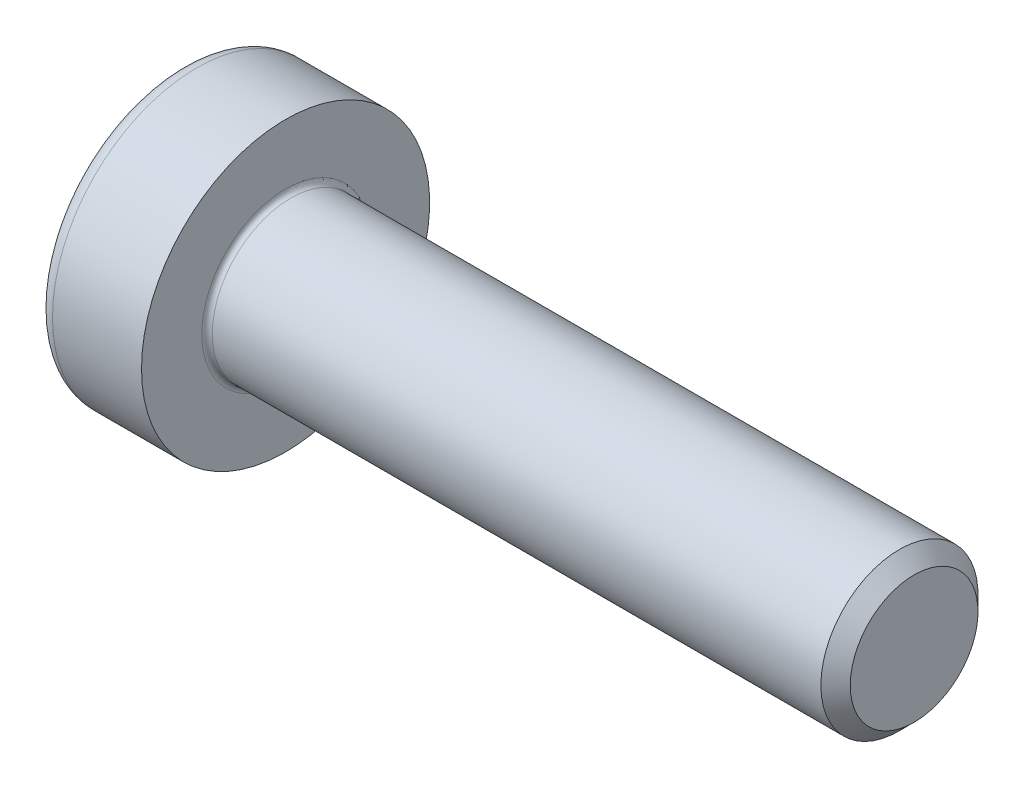
ISO-10303-21;
HEADER;
FILE_DESCRIPTION(('STEP AP214'),'2;1');
FILE_NAME('part.step','',(''),(''),'','','');
FILE_SCHEMA(('AUTOMOTIVE_DESIGN { 1 0 10303 214 1 1 1 1 }'));
ENDSEC;
DATA;
#1=APPLICATION_CONTEXT('core data for automotive mechanical design processes');
#2=APPLICATION_PROTOCOL_DEFINITION('international standard','automotive_design',2000,#1);
#3=PRODUCT_CONTEXT('',#1,'mechanical');
#4=PRODUCT('Part','Part','',(#3));
#5=PRODUCT_RELATED_PRODUCT_CATEGORY('part','',(#4));
#6=PRODUCT_DEFINITION_FORMATION('','',#4);
#7=PRODUCT_DEFINITION_CONTEXT('part definition',#1,'design');
#8=PRODUCT_DEFINITION('design','',#6,#7);
#9=PRODUCT_DEFINITION_SHAPE('','',#8);
#10=(LENGTH_UNIT() NAMED_UNIT(*) SI_UNIT(.MILLI.,.METRE.));
#11=(NAMED_UNIT(*) PLANE_ANGLE_UNIT() SI_UNIT($,.RADIAN.));
#12=(NAMED_UNIT(*) SI_UNIT($,.STERADIAN.) SOLID_ANGLE_UNIT());
#13=UNCERTAINTY_MEASURE_WITH_UNIT(LENGTH_MEASURE(1.E-05),#10,'distance_accuracy_value','');
#14=(GEOMETRIC_REPRESENTATION_CONTEXT(3) GLOBAL_UNCERTAINTY_ASSIGNED_CONTEXT((#13)) GLOBAL_UNIT_ASSIGNED_CONTEXT((#10,
#11,#12)) REPRESENTATION_CONTEXT('',''));
#15=CARTESIAN_POINT('',(0.,0.,0.));
#16=DIRECTION('',(0.,0.,1.));
#17=DIRECTION('',(1.,0.,0.));
#18=AXIS2_PLACEMENT_3D('',#15,#16,#17);
#19=CARTESIAN_POINT('',(0.,0.,0.));
#20=DIRECTION('',(-1.,0.,0.));
#21=DIRECTION('',(0.,0.,1.));
#22=AXIS2_PLACEMENT_3D('',#19,#20,#21);
#23=PLANE('',#22);
#24=DIRECTION('',(0.,-0.499999999999998,0.86602540378444));
#25=VECTOR('',#24,1.);
#26=CARTESIAN_POINT('',(0.,1.15470053837926,0.));
#27=LINE('',#26,#25);
#28=CARTESIAN_POINT('',(0.,1.15470053837926,0.));
#29=VERTEX_POINT('',#28);
#30=CARTESIAN_POINT('',(0.,0.577350269189634,0.999999999999994));
#31=VERTEX_POINT('',#30);
#32=EDGE_CURVE('E376',#29,#31,#27,.T.);
#33=ORIENTED_EDGE('',*,*,#32,.T.);
#34=DIRECTION('',(0.,1.,0.));
#35=VECTOR('',#34,1.);
#36=CARTESIAN_POINT('',(0.,-0.577350269189617,0.999999999999996));
#37=LINE('',#36,#35);
#38=CARTESIAN_POINT('',(0.,-0.577350269189617,0.999999999999996));
#39=VERTEX_POINT('',#38);
#40=EDGE_CURVE('E133',#39,#31,#37,.T.);
#41=ORIENTED_EDGE('',*,*,#40,.F.);
#42=DIRECTION('',(0.,-0.500000000000001,-0.866025403784438));
#43=VECTOR('',#42,1.);
#44=CARTESIAN_POINT('',(0.,-0.577350269189617,0.999999999999996));
#45=LINE('',#44,#43);
#46=CARTESIAN_POINT('',(0.,-1.15470053837924,0.));
#47=VERTEX_POINT('',#46);
#48=EDGE_CURVE('E379',#39,#47,#45,.T.);
#49=ORIENTED_EDGE('',*,*,#48,.T.);
#50=DIRECTION('',(0.,0.499999999999997,-0.86602540378444));
#51=VECTOR('',#50,1.);
#52=CARTESIAN_POINT('',(0.,-1.15470053837924,0.));
#53=LINE('',#52,#51);
#54=CARTESIAN_POINT('',(0.,-0.577350269189621,-1.));
#55=VERTEX_POINT('',#54);
#56=EDGE_CURVE('E382',#47,#55,#53,.T.);
#57=ORIENTED_EDGE('',*,*,#56,.T.);
#58=DIRECTION('',(0.,-1.,0.));
#59=VECTOR('',#58,1.);
#60=CARTESIAN_POINT('',(0.,0.57735026918963,-1.00000000000001));
#61=LINE('',#60,#59);
#62=CARTESIAN_POINT('',(0.,0.57735026918963,-1.00000000000001));
#63=VERTEX_POINT('',#62);
#64=EDGE_CURVE('E385',#63,#55,#61,.T.);
#65=ORIENTED_EDGE('',*,*,#64,.F.);
#66=DIRECTION('',(0.,-0.500000000000001,-0.866025403784438));
#67=VECTOR('',#66,1.);
#68=CARTESIAN_POINT('',(0.,1.15470053837926,0.));
#69=LINE('',#68,#67);
#70=EDGE_CURVE('E128',#29,#63,#69,.T.);
#71=ORIENTED_EDGE('',*,*,#70,.F.);
#72=EDGE_LOOP('',(#33,#41,#49,#57,#65,#71));
#73=FACE_BOUND('',#72,.T.);
#74=CARTESIAN_POINT('',(0.,0.,0.));
#75=DIRECTION('',(-1.,0.,0.));
#76=DIRECTION('',(0.,0.,1.));
#77=AXIS2_PLACEMENT_3D('',#74,#75,#76);
#78=CIRCLE('',#77,2.45);
#79=CARTESIAN_POINT('',(0.,0.,2.45));
#80=VERTEX_POINT('',#79);
#81=EDGE_CURVE('E45',#80,#80,#78,.T.);
#82=ORIENTED_EDGE('',*,*,#81,.T.);
#83=EDGE_LOOP('',(#82));
#84=FACE_BOUND('',#83,.T.);
#85=ADVANCED_FACE('F37',(#73,#84),#23,.T.);
#86=CARTESIAN_POINT('',(14.,1.2195,0.));
#87=DIRECTION('',(1.,0.,0.));
#88=DIRECTION('',(0.,0.,-1.));
#89=AXIS2_PLACEMENT_3D('',#86,#87,#88);
#90=PLANE('',#89);
#91=CARTESIAN_POINT('',(14.,0.,0.));
#92=DIRECTION('',(-1.,0.,0.));
#93=DIRECTION('',(0.,0.,1.));
#94=AXIS2_PLACEMENT_3D('',#91,#92,#93);
#95=CIRCLE('',#94,1.2195);
#96=CARTESIAN_POINT('',(14.,0.,1.2195));
#97=VERTEX_POINT('',#96);
#98=EDGE_CURVE('E151',#97,#97,#95,.T.);
#99=ORIENTED_EDGE('',*,*,#98,.F.);
#100=EDGE_LOOP('',(#99));
#101=FACE_BOUND('',#100,.T.);
#102=ADVANCED_FACE('F175',(#101),#90,.T.);
#103=CARTESIAN_POINT('',(14.,0.,0.));
#104=DIRECTION('',(-1.,0.,0.));
#105=DIRECTION('',(0.,0.,1.));
#106=AXIS2_PLACEMENT_3D('',#103,#104,#105);
#107=CONICAL_SURFACE('',#106,1.2195,0.785398163397433);
#108=CARTESIAN_POINT('',(13.7195,0.,0.));
#109=DIRECTION('',(-1.,0.,0.));
#110=DIRECTION('',(0.,0.,1.));
#111=AXIS2_PLACEMENT_3D('',#108,#109,#110);
#112=CIRCLE('',#111,1.49999999999999);
#113=CARTESIAN_POINT('',(13.7195,0.,1.49999999999999));
#114=VERTEX_POINT('',#113);
#115=EDGE_CURVE('E148',#114,#114,#112,.T.);
#116=ORIENTED_EDGE('',*,*,#115,.F.);
#117=EDGE_LOOP('',(#116));
#118=FACE_BOUND('',#117,.T.);
#119=ORIENTED_EDGE('',*,*,#98,.T.);
#120=EDGE_LOOP('',(#119));
#121=FACE_BOUND('',#120,.T.);
#122=ADVANCED_FACE('F181',(#118,#121),#107,.T.);
#123=CARTESIAN_POINT('',(-31.75,0.,0.));
#124=DIRECTION('',(-1.,0.,0.));
#125=DIRECTION('',(0.,0.,1.));
#126=AXIS2_PLACEMENT_3D('',#123,#124,#125);
#127=CYLINDRICAL_SURFACE('',#126,1.5);
#128=CARTESIAN_POINT('',(2.1,0.,0.));
#129=DIRECTION('',(1.,0.,0.));
#130=DIRECTION('',(0.,0.,-1.));
#131=AXIS2_PLACEMENT_3D('',#128,#129,#130);
#132=CIRCLE('',#131,1.5);
#133=CARTESIAN_POINT('',(2.1,0.,-1.5));
#134=VERTEX_POINT('',#133);
#135=EDGE_CURVE('E157',#134,#134,#132,.T.);
#136=ORIENTED_EDGE('',*,*,#135,.T.);
#137=EDGE_LOOP('',(#136));
#138=FACE_BOUND('',#137,.T.);
#139=ORIENTED_EDGE('',*,*,#115,.T.);
#140=EDGE_LOOP('',(#139));
#141=FACE_BOUND('',#140,.T.);
#142=ADVANCED_FACE('F193',(#138,#141),#127,.T.);
#143=CARTESIAN_POINT('',(2.,2.75,0.));
#144=DIRECTION('',(1.,0.,0.));
#145=DIRECTION('',(0.,0.,-1.));
#146=AXIS2_PLACEMENT_3D('',#143,#144,#145);
#147=PLANE('',#146);
#148=CARTESIAN_POINT('',(2.,0.,0.));
#149=DIRECTION('',(1.,0.,0.));
#150=DIRECTION('',(0.,0.,-1.));
#151=AXIS2_PLACEMENT_3D('',#148,#149,#150);
#152=CIRCLE('',#151,1.6);
#153=CARTESIAN_POINT('',(2.,0.,-1.6));
#154=VERTEX_POINT('',#153);
#155=EDGE_CURVE('E154',#154,#154,#152,.F.);
#156=ORIENTED_EDGE('',*,*,#155,.T.);
#157=EDGE_LOOP('',(#156));
#158=FACE_BOUND('',#157,.T.);
#159=CARTESIAN_POINT('',(2.,0.,0.));
#160=DIRECTION('',(-1.,0.,0.));
#161=DIRECTION('',(0.,0.,1.));
#162=AXIS2_PLACEMENT_3D('',#159,#160,#161);
#163=CIRCLE('',#162,2.75);
#164=CARTESIAN_POINT('',(2.,0.,2.75));
#165=VERTEX_POINT('',#164);
#166=EDGE_CURVE('E144',#165,#165,#163,.T.);
#167=ORIENTED_EDGE('',*,*,#166,.F.);
#168=EDGE_LOOP('',(#167));
#169=FACE_BOUND('',#168,.T.);
#170=ADVANCED_FACE('F189',(#158,#169),#147,.T.);
#171=CARTESIAN_POINT('',(-31.75,0.,0.));
#172=DIRECTION('',(-1.,0.,0.));
#173=DIRECTION('',(0.,0.,1.));
#174=AXIS2_PLACEMENT_3D('',#171,#172,#173);
#175=CYLINDRICAL_SURFACE('',#174,2.75);
#176=CARTESIAN_POINT('',(0.300000000000002,0.,0.));
#177=DIRECTION('',(-1.,0.,0.));
#178=DIRECTION('',(0.,0.,1.));
#179=AXIS2_PLACEMENT_3D('',#176,#177,#178);
#180=CIRCLE('',#179,2.75);
#181=CARTESIAN_POINT('',(0.300000000000002,0.,2.75));
#182=VERTEX_POINT('',#181);
#183=EDGE_CURVE('E11',#182,#182,#180,.F.);
#184=ORIENTED_EDGE('',*,*,#183,.T.);
#185=EDGE_LOOP('',(#184));
#186=FACE_BOUND('',#185,.T.);
#187=ORIENTED_EDGE('',*,*,#166,.T.);
#188=EDGE_LOOP('',(#187));
#189=FACE_BOUND('',#188,.T.);
#190=ADVANCED_FACE('F171',(#186,#189),#175,.T.);
#191=CARTESIAN_POINT('',(2.1,0.,0.));
#192=DIRECTION('',(1.,0.,0.));
#193=DIRECTION('',(0.,0.,-1.));
#194=AXIS2_PLACEMENT_3D('',#191,#192,#193);
#195=TOROIDAL_SURFACE('',#194,1.6,0.1);
#196=ORIENTED_EDGE('',*,*,#135,.F.);
#197=EDGE_LOOP('',(#196));
#198=FACE_BOUND('',#197,.T.);
#199=ORIENTED_EDGE('',*,*,#155,.F.);
#200=EDGE_LOOP('',(#199));
#201=FACE_BOUND('',#200,.T.);
#202=ADVANCED_FACE('F164',(#198,#201),#195,.F.);
#203=CARTESIAN_POINT('',(0.300000000000002,0.,0.));
#204=DIRECTION('',(-1.,0.,0.));
#205=DIRECTION('',(0.,0.,1.));
#206=AXIS2_PLACEMENT_3D('',#203,#204,#205);
#207=TOROIDAL_SURFACE('',#206,2.45,0.3);
#208=ORIENTED_EDGE('',*,*,#183,.F.);
#209=EDGE_LOOP('',(#208));
#210=FACE_BOUND('',#209,.T.);
#211=ORIENTED_EDGE('',*,*,#81,.F.);
#212=EDGE_LOOP('',(#211));
#213=FACE_BOUND('',#212,.T.);
#214=ADVANCED_FACE('F39',(#210,#213),#207,.T.);
#215=CARTESIAN_POINT('',(1.5,1.15470053837926,0.));
#216=DIRECTION('',(0.,-0.86602540378444,-0.499999999999998));
#217=DIRECTION('',(0.,0.499999999999998,-0.86602540378444));
#218=AXIS2_PLACEMENT_3D('',#215,#216,#217);
#219=PLANE('',#218);
#220=ORIENTED_EDGE('',*,*,#32,.F.);
#221=DIRECTION('',(-1.,0.,0.));
#222=VECTOR('',#221,1.);
#223=CARTESIAN_POINT('',(1.5,1.15470053837926,0.));
#224=LINE('',#223,#222);
#225=CARTESIAN_POINT('',(1.5,1.15470053837926,0.));
#226=VERTEX_POINT('',#225);
#227=EDGE_CURVE('E366',#226,#29,#224,.T.);
#228=ORIENTED_EDGE('',*,*,#227,.F.);
#229=DIRECTION('',(0.,-0.499999999999998,0.86602540378444));
#230=VECTOR('',#229,1.);
#231=CARTESIAN_POINT('',(1.5,1.15470053837926,0.));
#232=LINE('',#231,#230);
#233=CARTESIAN_POINT('',(1.5,0.866025403784442,0.499999999999999));
#234=VERTEX_POINT('',#233);
#235=EDGE_CURVE('E120',#226,#234,#232,.T.);
#236=ORIENTED_EDGE('',*,*,#235,.T.);
#237=CARTESIAN_POINT('',(1.5,0.577350269189634,0.999999999999994));
#238=VERTEX_POINT('',#237);
#239=EDGE_CURVE('E111',#234,#238,#232,.T.);
#240=ORIENTED_EDGE('',*,*,#239,.T.);
#241=DIRECTION('',(-1.,0.,0.));
#242=VECTOR('',#241,1.);
#243=CARTESIAN_POINT('',(1.5,0.577350269189634,0.999999999999994));
#244=LINE('',#243,#242);
#245=EDGE_CURVE('E125',#238,#31,#244,.T.);
#246=ORIENTED_EDGE('',*,*,#245,.T.);
#247=EDGE_LOOP('',(#220,#228,#236,#240,#246));
#248=FACE_BOUND('',#247,.T.);
#249=ADVANCED_FACE('F124',(#248),#219,.T.);
#250=CARTESIAN_POINT('',(1.5,-0.577350269189617,0.999999999999996));
#251=DIRECTION('',(0.,0.,1.));
#252=DIRECTION('',(0.,-1.,0.));
#253=AXIS2_PLACEMENT_3D('',#250,#251,#252);
#254=PLANE('',#253);
#255=ORIENTED_EDGE('',*,*,#40,.T.);
#256=ORIENTED_EDGE('',*,*,#245,.F.);
#257=DIRECTION('',(0.,1.,0.));
#258=VECTOR('',#257,1.);
#259=CARTESIAN_POINT('',(1.5,-0.577350269189617,0.999999999999996));
#260=LINE('',#259,#258);
#261=CARTESIAN_POINT('',(1.5,0.,0.999999999999995));
#262=VERTEX_POINT('',#261);
#263=EDGE_CURVE('E108',#262,#238,#260,.T.);
#264=ORIENTED_EDGE('',*,*,#263,.F.);
#265=CARTESIAN_POINT('',(1.5,-0.577350269189617,0.999999999999996));
#266=VERTEX_POINT('',#265);
#267=EDGE_CURVE('E119',#266,#262,#260,.T.);
#268=ORIENTED_EDGE('',*,*,#267,.F.);
#269=DIRECTION('',(-1.,0.,0.));
#270=VECTOR('',#269,1.);
#271=CARTESIAN_POINT('',(1.5,-0.577350269189617,0.999999999999996));
#272=LINE('',#271,#270);
#273=EDGE_CURVE('E135',#266,#39,#272,.T.);
#274=ORIENTED_EDGE('',*,*,#273,.T.);
#275=EDGE_LOOP('',(#255,#256,#264,#268,#274));
#276=FACE_BOUND('',#275,.T.);
#277=ADVANCED_FACE('F130',(#276),#254,.F.);
#278=CARTESIAN_POINT('',(1.5,-0.577350269189617,0.999999999999996));
#279=DIRECTION('',(0.,0.866025403784438,-0.500000000000001));
#280=DIRECTION('',(0.,0.500000000000001,0.866025403784438));
#281=AXIS2_PLACEMENT_3D('',#278,#279,#280);
#282=PLANE('',#281);
#283=ORIENTED_EDGE('',*,*,#48,.F.);
#284=ORIENTED_EDGE('',*,*,#273,.F.);
#285=DIRECTION('',(0.,-0.500000000000001,-0.866025403784438));
#286=VECTOR('',#285,1.);
#287=CARTESIAN_POINT('',(1.5,-0.577350269189617,0.999999999999996));
#288=LINE('',#287,#286);
#289=CARTESIAN_POINT('',(1.5,-0.86602540378443,0.499999999999997));
#290=VERTEX_POINT('',#289);
#291=EDGE_CURVE('E405',#266,#290,#288,.T.);
#292=ORIENTED_EDGE('',*,*,#291,.T.);
#293=CARTESIAN_POINT('',(1.5,-1.15470053837924,0.));
#294=VERTEX_POINT('',#293);
#295=EDGE_CURVE('E394',#290,#294,#288,.T.);
#296=ORIENTED_EDGE('',*,*,#295,.T.);
#297=DIRECTION('',(-1.,0.,0.));
#298=VECTOR('',#297,1.);
#299=CARTESIAN_POINT('',(1.5,-1.15470053837924,0.));
#300=LINE('',#299,#298);
#301=EDGE_CURVE('E140',#294,#47,#300,.T.);
#302=ORIENTED_EDGE('',*,*,#301,.T.);
#303=EDGE_LOOP('',(#283,#284,#292,#296,#302));
#304=FACE_BOUND('',#303,.T.);
#305=ADVANCED_FACE('F257',(#304),#282,.T.);
#306=CARTESIAN_POINT('',(1.5,-1.15470053837924,0.));
#307=DIRECTION('',(0.,0.86602540378444,0.499999999999998));
#308=DIRECTION('',(0.,-0.499999999999998,0.86602540378444));
#309=AXIS2_PLACEMENT_3D('',#306,#307,#308);
#310=PLANE('',#309);
#311=ORIENTED_EDGE('',*,*,#56,.F.);
#312=ORIENTED_EDGE('',*,*,#301,.F.);
#313=DIRECTION('',(0.,0.499999999999997,-0.86602540378444));
#314=VECTOR('',#313,1.);
#315=CARTESIAN_POINT('',(1.5,-1.15470053837924,0.));
#316=LINE('',#315,#314);
#317=CARTESIAN_POINT('',(1.5,-0.866025403784436,-0.499999999999995));
#318=VERTEX_POINT('',#317);
#319=EDGE_CURVE('E372',#294,#318,#316,.T.);
#320=ORIENTED_EDGE('',*,*,#319,.T.);
#321=CARTESIAN_POINT('',(1.5,-0.577350269189621,-1.));
#322=VERTEX_POINT('',#321);
#323=EDGE_CURVE('E404',#318,#322,#316,.T.);
#324=ORIENTED_EDGE('',*,*,#323,.T.);
#325=DIRECTION('',(-1.,0.,0.));
#326=VECTOR('',#325,1.);
#327=CARTESIAN_POINT('',(1.5,-0.577350269189621,-1.));
#328=LINE('',#327,#326);
#329=EDGE_CURVE('E365',#322,#55,#328,.T.);
#330=ORIENTED_EDGE('',*,*,#329,.T.);
#331=EDGE_LOOP('',(#311,#312,#320,#324,#330));
#332=FACE_BOUND('',#331,.T.);
#333=ADVANCED_FACE('F265',(#332),#310,.T.);
#334=CARTESIAN_POINT('',(1.5,0.57735026918963,-1.00000000000001));
#335=DIRECTION('',(0.,0.,-1.));
#336=DIRECTION('',(0.,1.,0.));
#337=AXIS2_PLACEMENT_3D('',#334,#335,#336);
#338=PLANE('',#337);
#339=ORIENTED_EDGE('',*,*,#64,.T.);
#340=ORIENTED_EDGE('',*,*,#329,.F.);
#341=DIRECTION('',(0.,-1.,0.));
#342=VECTOR('',#341,1.);
#343=CARTESIAN_POINT('',(1.5,0.57735026918963,-1.00000000000001));
#344=LINE('',#343,#342);
#345=CARTESIAN_POINT('',(1.5,0.,-1.));
#346=VERTEX_POINT('',#345);
#347=EDGE_CURVE('E369',#346,#322,#344,.T.);
#348=ORIENTED_EDGE('',*,*,#347,.F.);
#349=CARTESIAN_POINT('',(1.5,0.57735026918963,-1.00000000000001));
#350=VERTEX_POINT('',#349);
#351=EDGE_CURVE('E52',#350,#346,#344,.T.);
#352=ORIENTED_EDGE('',*,*,#351,.F.);
#353=DIRECTION('',(-1.,0.,0.));
#354=VECTOR('',#353,1.);
#355=CARTESIAN_POINT('',(1.5,0.57735026918963,-1.00000000000001));
#356=LINE('',#355,#354);
#357=EDGE_CURVE('E362',#350,#63,#356,.T.);
#358=ORIENTED_EDGE('',*,*,#357,.T.);
#359=EDGE_LOOP('',(#339,#340,#348,#352,#358));
#360=FACE_BOUND('',#359,.T.);
#361=ADVANCED_FACE('F274',(#360),#338,.F.);
#362=CARTESIAN_POINT('',(1.5,1.15470053837926,0.));
#363=DIRECTION('',(0.,0.866025403784438,-0.500000000000001));
#364=DIRECTION('',(0.,0.500000000000001,0.866025403784438));
#365=AXIS2_PLACEMENT_3D('',#362,#363,#364);
#366=PLANE('',#365);
#367=ORIENTED_EDGE('',*,*,#70,.T.);
#368=ORIENTED_EDGE('',*,*,#357,.F.);
#369=DIRECTION('',(0.,-0.500000000000001,-0.866025403784438));
#370=VECTOR('',#369,1.);
#371=CARTESIAN_POINT('',(1.5,1.15470053837926,0.));
#372=LINE('',#371,#370);
#373=CARTESIAN_POINT('',(1.5,0.866025403784445,-0.500000000000005));
#374=VERTEX_POINT('',#373);
#375=EDGE_CURVE('E352',#374,#350,#372,.T.);
#376=ORIENTED_EDGE('',*,*,#375,.F.);
#377=EDGE_CURVE('E358',#226,#374,#372,.T.);
#378=ORIENTED_EDGE('',*,*,#377,.F.);
#379=ORIENTED_EDGE('',*,*,#227,.T.);
#380=EDGE_LOOP('',(#367,#368,#376,#378,#379));
#381=FACE_BOUND('',#380,.T.);
#382=ADVANCED_FACE('F283',(#381),#366,.F.);
#383=CARTESIAN_POINT('',(1.5,1.73205080756888,-1.00000000000001));
#384=DIRECTION('',(1.,0.,0.));
#385=DIRECTION('',(0.,0.,-1.));
#386=AXIS2_PLACEMENT_3D('',#383,#384,#385);
#387=PLANE('',#386);
#388=ORIENTED_EDGE('',*,*,#347,.T.);
#389=ORIENTED_EDGE('',*,*,#323,.F.);
#390=CARTESIAN_POINT('',(1.5,0.,0.));
#391=DIRECTION('',(-1.,0.,0.));
#392=DIRECTION('',(0.,0.,1.));
#393=AXIS2_PLACEMENT_3D('',#390,#391,#392);
#394=CIRCLE('',#393,1.);
#395=EDGE_CURVE('E400',#346,#318,#394,.T.);
#396=ORIENTED_EDGE('',*,*,#395,.F.);
#397=EDGE_LOOP('',(#388,#389,#396));
#398=FACE_BOUND('',#397,.T.);
#399=ADVANCED_FACE('F292',(#398),#387,.F.);
#400=ORIENTED_EDGE('',*,*,#319,.F.);
#401=ORIENTED_EDGE('',*,*,#295,.F.);
#402=EDGE_CURVE('E138',#318,#290,#394,.T.);
#403=ORIENTED_EDGE('',*,*,#402,.F.);
#404=EDGE_LOOP('',(#400,#401,#403));
#405=FACE_BOUND('',#404,.T.);
#406=ADVANCED_FACE('F301',(#405),#387,.F.);
#407=ORIENTED_EDGE('',*,*,#291,.F.);
#408=ORIENTED_EDGE('',*,*,#267,.T.);
#409=EDGE_CURVE('E134',#290,#262,#394,.T.);
#410=ORIENTED_EDGE('',*,*,#409,.F.);
#411=EDGE_LOOP('',(#407,#408,#410));
#412=FACE_BOUND('',#411,.T.);
#413=ADVANCED_FACE('F310',(#412),#387,.F.);
#414=ORIENTED_EDGE('',*,*,#263,.T.);
#415=ORIENTED_EDGE('',*,*,#239,.F.);
#416=EDGE_CURVE('E114',#262,#234,#394,.T.);
#417=ORIENTED_EDGE('',*,*,#416,.F.);
#418=EDGE_LOOP('',(#414,#415,#417));
#419=FACE_BOUND('',#418,.T.);
#420=ADVANCED_FACE('F110',(#419),#387,.F.);
#421=ORIENTED_EDGE('',*,*,#235,.F.);
#422=ORIENTED_EDGE('',*,*,#377,.T.);
#423=EDGE_CURVE('E145',#234,#374,#394,.T.);
#424=ORIENTED_EDGE('',*,*,#423,.F.);
#425=EDGE_LOOP('',(#421,#422,#424));
#426=FACE_BOUND('',#425,.T.);
#427=ADVANCED_FACE('F325',(#426),#387,.F.);
#428=ORIENTED_EDGE('',*,*,#375,.T.);
#429=ORIENTED_EDGE('',*,*,#351,.T.);
#430=EDGE_CURVE('E355',#374,#346,#394,.T.);
#431=ORIENTED_EDGE('',*,*,#430,.F.);
#432=EDGE_LOOP('',(#428,#429,#431));
#433=FACE_BOUND('',#432,.T.);
#434=ADVANCED_FACE('F240',(#433),#387,.F.);
#435=CARTESIAN_POINT('',(1.5,0.,0.));
#436=DIRECTION('',(-1.,0.,0.));
#437=DIRECTION('',(0.,0.,1.));
#438=AXIS2_PLACEMENT_3D('',#435,#436,#437);
#439=CONICAL_SURFACE('',#438,1.,1.04719755119659);
#440=CARTESIAN_POINT('',(2.07735026918963,0.,0.));
#441=VERTEX_POINT('',#440);
#442=VERTEX_LOOP('',#441);
#443=FACE_BOUND('',#442,.T.);
#444=ORIENTED_EDGE('',*,*,#416,.T.);
#445=ORIENTED_EDGE('',*,*,#423,.T.);
#446=ORIENTED_EDGE('',*,*,#430,.T.);
#447=ORIENTED_EDGE('',*,*,#395,.T.);
#448=ORIENTED_EDGE('',*,*,#402,.T.);
#449=ORIENTED_EDGE('',*,*,#409,.T.);
#450=EDGE_LOOP('',(#444,#445,#446,#447,#448,#449));
#451=FACE_BOUND('',#450,.T.);
#452=ADVANCED_FACE('F186',(#443,#451),#439,.F.);
#453=CLOSED_SHELL('',(#85,#102,#122,#142,#170,#190,#202,#214,#249,#277,#305,#333,#361,#382,#399,
#406,#413,#420,#427,#434,#452));
#454=MANIFOLD_SOLID_BREP('B2',#453);
#455=ADVANCED_BREP_SHAPE_REPRESENTATION('',(#18,#454),#14);
#456=SHAPE_DEFINITION_REPRESENTATION(#9,#455);
ENDSEC;
END-ISO-10303-21;
